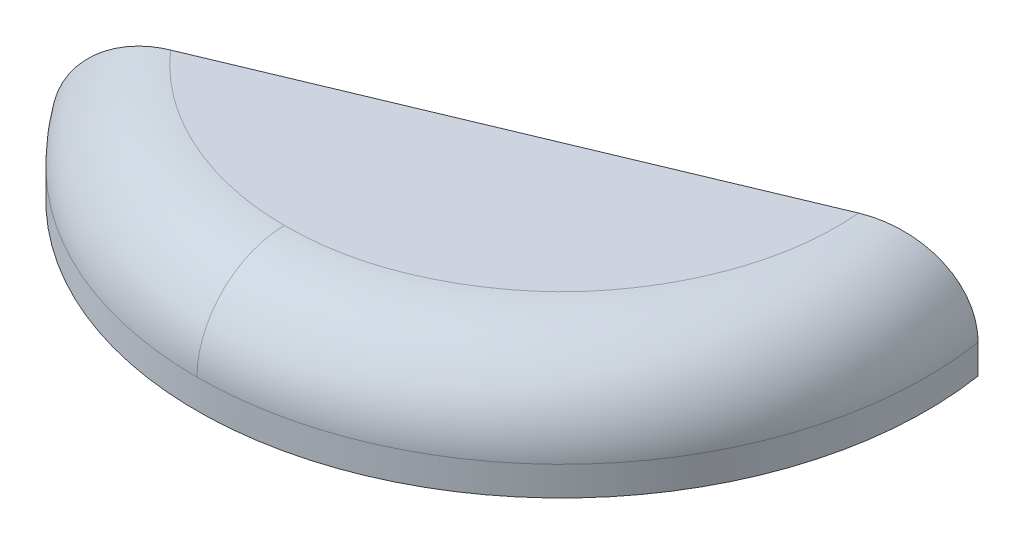
ISO-10303-21;
HEADER;
FILE_DESCRIPTION(('STEP AP214'),'2;1');
FILE_NAME('part.step','',(''),(''),'','','');
FILE_SCHEMA(('AUTOMOTIVE_DESIGN { 1 0 10303 214 1 1 1 1 }'));
ENDSEC;
DATA;
#1=APPLICATION_CONTEXT('core data for automotive mechanical design processes');
#2=APPLICATION_PROTOCOL_DEFINITION('international standard','automotive_design',2000,#1);
#3=PRODUCT_CONTEXT('',#1,'mechanical');
#4=PRODUCT('Part','Part','',(#3));
#5=PRODUCT_RELATED_PRODUCT_CATEGORY('part','',(#4));
#6=PRODUCT_DEFINITION_FORMATION('','',#4);
#7=PRODUCT_DEFINITION_CONTEXT('part definition',#1,'design');
#8=PRODUCT_DEFINITION('design','',#6,#7);
#9=PRODUCT_DEFINITION_SHAPE('','',#8);
#10=(LENGTH_UNIT() NAMED_UNIT(*) SI_UNIT(.MILLI.,.METRE.));
#11=(NAMED_UNIT(*) PLANE_ANGLE_UNIT() SI_UNIT($,.RADIAN.));
#12=(NAMED_UNIT(*) SI_UNIT($,.STERADIAN.) SOLID_ANGLE_UNIT());
#13=UNCERTAINTY_MEASURE_WITH_UNIT(LENGTH_MEASURE(1.E-05),#10,'distance_accuracy_value','');
#14=(GEOMETRIC_REPRESENTATION_CONTEXT(3) GLOBAL_UNCERTAINTY_ASSIGNED_CONTEXT((#13)) GLOBAL_UNIT_ASSIGNED_CONTEXT((#10,
#11,#12)) REPRESENTATION_CONTEXT('',''));
#15=CARTESIAN_POINT('',(0.,0.,0.));
#16=DIRECTION('',(0.,0.,1.));
#17=DIRECTION('',(1.,0.,0.));
#18=AXIS2_PLACEMENT_3D('',#15,#16,#17);
#19=CARTESIAN_POINT('',(10.052656276904,8.1,-18.92022680739));
#20=DIRECTION('',(0.,-1.,0.));
#21=DIRECTION('',(0.,0.,-1.));
#22=AXIS2_PLACEMENT_3D('',#19,#20,#21);
#23=PLANE('',#22);
#24=CARTESIAN_POINT('',(8.802554399905,8.1000000004,-18.16644269139));
#25=DIRECTION('',(0.,-1.,0.));
#26=DIRECTION('',(1.,0.,0.));
#27=AXIS2_PLACEMENT_3D('',#24,#25,#26);
#28=CIRCLE('',#27,1.25);
#29=CARTESIAN_POINT('',(10.0378329347998,8.10000000016667,-18.3577198243686));
#30=VERTEX_POINT('',#29);
#31=CARTESIAN_POINT('',(7.79870954697041,8.10000000016667,-17.4215967264339));
#32=VERTEX_POINT('',#31);
#33=EDGE_CURVE('E11',#30,#32,#28,.T.);
#34=ORIENTED_EDGE('',*,*,#33,.T.);
#35=DIRECTION('',(-0.922614718858317,0.,0.385722802730132));
#36=VECTOR('',#35,1.);
#37=CARTESIAN_POINT('',(10.037832934904,8.1,-18.35771982439));
#38=LINE('',#37,#36);
#39=EDGE_CURVE('E115',#30,#32,#38,.T.);
#40=ORIENTED_EDGE('',*,*,#39,.F.);
#41=EDGE_LOOP('',(#34,#40));
#42=FACE_BOUND('',#41,.T.);
#43=ADVANCED_FACE('F17',(#42),#23,.T.);
#44=CARTESIAN_POINT('',(8.802554399905,8.2,-18.16644269139));
#45=DIRECTION('',(0.,-1.,0.));
#46=DIRECTION('',(-1.,0.,0.));
#47=AXIS2_PLACEMENT_3D('',#44,#45,#46);
#48=CYLINDRICAL_SURFACE('',#47,1.25);
#49=DIRECTION('',(0.,1.,0.));
#50=VECTOR('',#49,1.);
#51=CARTESIAN_POINT('',(7.798709546905,8.3,-17.42159672639));
#52=LINE('',#51,#50);
#53=CARTESIAN_POINT('',(7.79870954702423,8.200000000018,-17.4215967264903));
#54=VERTEX_POINT('',#53);
#55=EDGE_CURVE('E28',#32,#54,#52,.T.);
#56=ORIENTED_EDGE('',*,*,#55,.F.);
#57=ORIENTED_EDGE('',*,*,#33,.F.);
#58=DIRECTION('',(0.,-1.,0.));
#59=VECTOR('',#58,1.);
#60=CARTESIAN_POINT('',(10.037832934904,8.3,-18.35771982439));
#61=LINE('',#60,#59);
#62=CARTESIAN_POINT('',(10.0378329347626,8.199999999997,-18.3577198243401));
#63=VERTEX_POINT('',#62);
#64=EDGE_CURVE('E151',#63,#30,#61,.T.);
#65=ORIENTED_EDGE('',*,*,#64,.F.);
#66=CARTESIAN_POINT('',(8.802554399905,8.2,-18.16644269139));
#67=DIRECTION('',(0.,-1.,0.));
#68=DIRECTION('',(0.,0.,1.));
#69=AXIS2_PLACEMENT_3D('',#66,#67,#68);
#70=CIRCLE('',#69,1.25);
#71=CARTESIAN_POINT('',(8.802554399905,8.200000000008,-16.9164426912566));
#72=VERTEX_POINT('',#71);
#73=EDGE_CURVE('E160',#63,#72,#70,.T.);
#74=ORIENTED_EDGE('',*,*,#73,.T.);
#75=CARTESIAN_POINT('',(8.802554399905,8.2,-18.16644269139));
#76=DIRECTION('',(0.,-1.,0.));
#77=DIRECTION('',(0.,0.,1.));
#78=AXIS2_PLACEMENT_3D('',#75,#76,#77);
#79=CIRCLE('',#78,1.25);
#80=EDGE_CURVE('E86',#72,#54,#79,.T.);
#81=ORIENTED_EDGE('',*,*,#80,.T.);
#82=EDGE_LOOP('',(#56,#57,#65,#74,#81));
#83=FACE_BOUND('',#82,.T.);
#84=ADVANCED_FACE('F133',(#83),#48,.T.);
#85=CARTESIAN_POINT('',(10.037832934904,8.1,-18.35771982439));
#86=DIRECTION('',(-0.385722802730132,0.,-0.922614718858317));
#87=DIRECTION('',(-0.922614718858317,0.,0.385722802730132));
#88=AXIS2_PLACEMENT_3D('',#85,#86,#87);
#89=PLANE('',#88);
#90=ORIENTED_EDGE('',*,*,#64,.T.);
#91=ORIENTED_EDGE('',*,*,#39,.T.);
#92=ORIENTED_EDGE('',*,*,#55,.T.);
#93=CARTESIAN_POINT('',(7.79870954709949,8.200000000024,-17.4215967264718));
#94=CARTESIAN_POINT('',(7.79870954702638,8.26139761349442,-17.4215967264413));
#95=CARTESIAN_POINT('',(7.82155750412855,8.31816272910729,-17.4311489023062));
#96=CARTESIAN_POINT('',(7.84279691634081,8.37093145956259,-17.4400285846258));
#97=CARTESIAN_POINT('',(7.88363143472825,8.41336687057612,-17.4571005048527));
#98=CARTESIAN_POINT('',(7.92241754839882,8.45367357040326,-17.4733160368253));
#99=CARTESIAN_POINT('',(7.97522642771462,8.47688757698939,-17.4953941464873));
#100=CARTESIAN_POINT('',(8.02780421930936,8.50000000081237,-17.5173756439865));
#101=CARTESIAN_POINT('',(8.08663757190373,8.50000000090602,-17.5419724395858));
#102=B_SPLINE_CURVE_WITH_KNOTS('',2,(#93,#94,#95,#96,#97,#98,#99,#100,#101),.UNSPECIFIED.,.F.,
.F.,(3,2,2,2,3),(0.,0.25,0.5,0.75,1.),.UNSPECIFIED.);
#103=CARTESIAN_POINT('',(8.08663757143963,8.50000000054361,-17.541972439783));
#104=VERTEX_POINT('',#103);
#105=EDGE_CURVE('E71',#54,#104,#102,.T.);
#106=ORIENTED_EDGE('',*,*,#105,.T.);
#107=DIRECTION('',(0.922614718858317,0.,-0.385722802730132));
#108=VECTOR('',#107,1.);
#109=CARTESIAN_POINT('',(8.918271240905,8.5,-17.88965827539));
#110=LINE('',#109,#108);
#111=CARTESIAN_POINT('',(9.74990490970337,8.50000000033052,-18.2373441111347));
#112=VERTEX_POINT('',#111);
#113=EDGE_CURVE('E77',#104,#112,#110,.T.);
#114=ORIENTED_EDGE('',*,*,#113,.T.);
#115=CARTESIAN_POINT('',(9.74990490958217,8.50000000055086,-18.2373441110596));
#116=CARTESIAN_POINT('',(9.80681145083402,8.50000000057721,-18.2611353536408));
#117=CARTESIAN_POINT('',(9.86047117035319,8.47718575919503,-18.2835691789241));
#118=CARTESIAN_POINT('',(9.91114351205974,8.45564164667539,-18.3047540541103));
#119=CARTESIAN_POINT('',(9.95216003940035,8.41416202350176,-18.3219020678593));
#120=CARTESIAN_POINT('',(9.99182718975479,8.37404701241341,-18.3384859398682));
#121=CARTESIAN_POINT('',(10.0147033498294,8.31905727619432,-18.3480499067108));
#122=CARTESIAN_POINT('',(10.037832934814,8.26345835692557,-18.3577198243524));
#123=CARTESIAN_POINT('',(10.0378329347459,8.199999999996,-18.3577198243239));
#124=B_SPLINE_CURVE_WITH_KNOTS('',2,(#115,#116,#117,#118,#119,#120,#121,#122,#123),
.UNSPECIFIED.,.F.,.F.,(3,2,2,2,3),(0.,0.25,0.5,0.75,1.),.UNSPECIFIED.);
#125=EDGE_CURVE('E157',#112,#63,#124,.T.);
#126=ORIENTED_EDGE('',*,*,#125,.T.);
#127=EDGE_LOOP('',(#90,#91,#92,#106,#114,#126));
#128=FACE_BOUND('',#127,.T.);
#129=ADVANCED_FACE('F75',(#128),#89,.T.);
#130=CARTESIAN_POINT('',(8.802554399395,8.200000000604,-18.16644269149));
#131=DIRECTION('',(-3.483648526748E-10,-1.,-4.074230057717E-10));
#132=DIRECTION('',(0.,-4.074230057717E-10,1.));
#133=AXIS2_PLACEMENT_3D('',#130,#131,#132);
#134=TOROIDAL_SURFACE('',#133,0.950000000328,0.300000000248);
#135=ORIENTED_EDGE('',*,*,#73,.F.);
#136=ORIENTED_EDGE('',*,*,#125,.F.);
#137=CARTESIAN_POINT('',(8.802554399905,8.5,-17.2164426912));
#138=CARTESIAN_POINT('',(8.92866388480674,8.5,-17.2164426912));
#139=CARTESIAN_POINT('',(9.1591504081345,8.5,-17.2586601470442));
#140=CARTESIAN_POINT('',(9.51740598559167,8.5,-17.4905704128654));
#141=CARTESIAN_POINT('',(9.73166576433284,8.5,-17.8651662938543));
#142=CARTESIAN_POINT('',(9.75958694822061,8.5,-18.1079773935831));
#143=CARTESIAN_POINT('',(9.74990490982,8.5,-18.23734411122));
#144=(BOUNDED_CURVE() B_SPLINE_CURVE(3,(#137,#138,#139,#140,#141,#142,#143),.UNSPECIFIED.,.F.,
.F.) B_SPLINE_CURVE_WITH_KNOTS((4,1,1,1,4),(0.,0.25,0.5,0.75,1.),
.UNSPECIFIED.) CURVE() GEOMETRIC_REPRESENTATION_ITEM() RATIONAL_B_SPLINE_CURVE((1.,1.,1.,1.,1.,
1.,1.)) REPRESENTATION_ITEM(''));
#145=CARTESIAN_POINT('',(8.80255439982896,8.50000000042928,-17.216442691225));
#146=VERTEX_POINT('',#145);
#147=EDGE_CURVE('E94',#146,#112,#144,.T.);
#148=ORIENTED_EDGE('',*,*,#147,.F.);
#149=CARTESIAN_POINT('',(8.802554399905,8.199999999949,-17.21644269145));
#150=DIRECTION('',(-1.,0.,0.));
#151=DIRECTION('',(0.,-0.0998334163444368,0.995004165308366));
#152=AXIS2_PLACEMENT_3D('',#149,#150,#151);
#153=CIRCLE('',#152,0.30000000046);
#154=EDGE_CURVE('E99',#72,#146,#153,.T.);
#155=ORIENTED_EDGE('',*,*,#154,.F.);
#156=EDGE_LOOP('',(#135,#136,#148,#155));
#157=FACE_BOUND('',#156,.T.);
#158=ADVANCED_FACE('F128',(#157),#134,.T.);
#159=CARTESIAN_POINT('',(8.802554401078,8.200000007447,-18.16644269188));
#160=DIRECTION('',(3.825660743154E-09,-1.,-7.287975575E-09));
#161=DIRECTION('',(0.,-7.287975575E-09,1.));
#162=AXIS2_PLACEMENT_3D('',#159,#160,#161);
#163=TOROIDAL_SURFACE('',#162,0.950000000445,0.300000000749);
#164=ORIENTED_EDGE('',*,*,#105,.F.);
#165=ORIENTED_EDGE('',*,*,#80,.F.);
#166=ORIENTED_EDGE('',*,*,#154,.T.);
#167=CARTESIAN_POINT('',(8.086637571015,8.5,-17.54197244019));
#168=CARTESIAN_POINT('',(8.2632478526249,8.5,-17.3394995886705));
#169=CARTESIAN_POINT('',(8.53141119367412,8.5,-17.2164426912));
#170=CARTESIAN_POINT('',(8.802554399905,8.5,-17.2164426912));
#171=(BOUNDED_CURVE() B_SPLINE_CURVE(3,(#167,#168,#169,#170),.UNSPECIFIED.,.F.,
.F.) B_SPLINE_CURVE_WITH_KNOTS((4,4),(0.,1.),
.UNSPECIFIED.) CURVE() GEOMETRIC_REPRESENTATION_ITEM() RATIONAL_B_SPLINE_CURVE((1.,1.,1.,1.)) REPRESENTATION_ITEM(''));
#172=EDGE_CURVE('E92',#104,#146,#171,.T.);
#173=ORIENTED_EDGE('',*,*,#172,.F.);
#174=EDGE_LOOP('',(#164,#165,#166,#173));
#175=FACE_BOUND('',#174,.T.);
#176=ADVANCED_FACE('F97',(#175),#163,.T.);
#177=CARTESIAN_POINT('',(9.762549900904,8.5,-18.24346952039));
#178=DIRECTION('',(0.,-1.,0.));
#179=DIRECTION('',(0.,0.,-1.));
#180=AXIS2_PLACEMENT_3D('',#177,#178,#179);
#181=PLANE('',#180);
#182=ORIENTED_EDGE('',*,*,#172,.T.);
#183=ORIENTED_EDGE('',*,*,#147,.T.);
#184=ORIENTED_EDGE('',*,*,#113,.F.);
#185=EDGE_LOOP('',(#182,#183,#184));
#186=FACE_BOUND('',#185,.T.);
#187=ADVANCED_FACE('F91',(#186),#181,.F.);
#188=CLOSED_SHELL('',(#43,#84,#129,#158,#176,#187));
#189=MANIFOLD_SOLID_BREP('B1',#188);
#190=ADVANCED_BREP_SHAPE_REPRESENTATION('',(#18,#189),#14);
#191=SHAPE_DEFINITION_REPRESENTATION(#9,#190);
ENDSEC;
END-ISO-10303-21;
